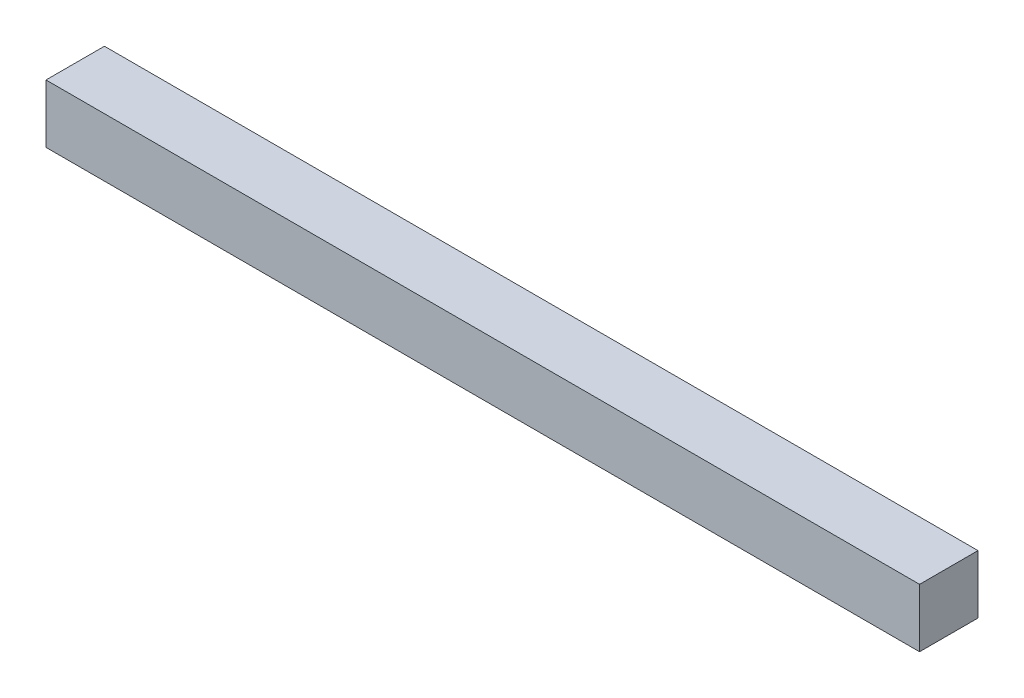
ISO-10303-21;
HEADER;
FILE_DESCRIPTION(('STEP AP214'),'2;1');
FILE_NAME('part.step','',(''),(''),'','','');
FILE_SCHEMA(('AUTOMOTIVE_DESIGN { 1 0 10303 214 1 1 1 1 }'));
ENDSEC;
DATA;
#1=APPLICATION_CONTEXT('core data for automotive mechanical design processes');
#2=APPLICATION_PROTOCOL_DEFINITION('international standard','automotive_design',2000,#1);
#3=PRODUCT_CONTEXT('',#1,'mechanical');
#4=PRODUCT('Part','Part','',(#3));
#5=PRODUCT_RELATED_PRODUCT_CATEGORY('part','',(#4));
#6=PRODUCT_DEFINITION_FORMATION('','',#4);
#7=PRODUCT_DEFINITION_CONTEXT('part definition',#1,'design');
#8=PRODUCT_DEFINITION('design','',#6,#7);
#9=PRODUCT_DEFINITION_SHAPE('','',#8);
#10=(LENGTH_UNIT() NAMED_UNIT(*) SI_UNIT(.MILLI.,.METRE.));
#11=(NAMED_UNIT(*) PLANE_ANGLE_UNIT() SI_UNIT($,.RADIAN.));
#12=(NAMED_UNIT(*) SI_UNIT($,.STERADIAN.) SOLID_ANGLE_UNIT());
#13=UNCERTAINTY_MEASURE_WITH_UNIT(LENGTH_MEASURE(1.E-05),#10,'distance_accuracy_value','');
#14=(GEOMETRIC_REPRESENTATION_CONTEXT(3) GLOBAL_UNCERTAINTY_ASSIGNED_CONTEXT((#13)) GLOBAL_UNIT_ASSIGNED_CONTEXT((#10,
#11,#12)) REPRESENTATION_CONTEXT('',''));
#15=CARTESIAN_POINT('',(0.,0.,0.));
#16=DIRECTION('',(0.,0.,1.));
#17=DIRECTION('',(1.,0.,0.));
#18=AXIS2_PLACEMENT_3D('',#15,#16,#17);
#19=CARTESIAN_POINT('',(189.9,6.35,6.35));
#20=DIRECTION('',(0.,-1.,0.));
#21=DIRECTION('',(0.,0.,-1.));
#22=AXIS2_PLACEMENT_3D('',#19,#20,#21);
#23=PLANE('',#22);
#24=DIRECTION('',(0.,0.,1.));
#25=VECTOR('',#24,1.);
#26=CARTESIAN_POINT('',(0.,6.35,6.35));
#27=LINE('',#26,#25);
#28=CARTESIAN_POINT('',(0.,6.35,-6.35));
#29=VERTEX_POINT('',#28);
#30=CARTESIAN_POINT('',(0.,6.35,6.35));
#31=VERTEX_POINT('',#30);
#32=EDGE_CURVE('E114',#29,#31,#27,.T.);
#33=ORIENTED_EDGE('',*,*,#32,.T.);
#34=DIRECTION('',(-1.,0.,0.));
#35=VECTOR('',#34,1.);
#36=CARTESIAN_POINT('',(189.9,6.35,6.35));
#37=LINE('',#36,#35);
#38=CARTESIAN_POINT('',(189.9,6.35,6.35));
#39=VERTEX_POINT('',#38);
#40=EDGE_CURVE('E11',#39,#31,#37,.T.);
#41=ORIENTED_EDGE('',*,*,#40,.F.);
#42=DIRECTION('',(0.,0.,1.));
#43=VECTOR('',#42,1.);
#44=CARTESIAN_POINT('',(189.9,6.35,6.35));
#45=LINE('',#44,#43);
#46=CARTESIAN_POINT('',(189.9,6.35,-6.35));
#47=VERTEX_POINT('',#46);
#48=EDGE_CURVE('E97',#47,#39,#45,.T.);
#49=ORIENTED_EDGE('',*,*,#48,.F.);
#50=DIRECTION('',(-1.,0.,0.));
#51=VECTOR('',#50,1.);
#52=CARTESIAN_POINT('',(189.9,6.35,-6.35));
#53=LINE('',#52,#51);
#54=EDGE_CURVE('E110',#47,#29,#53,.T.);
#55=ORIENTED_EDGE('',*,*,#54,.T.);
#56=EDGE_LOOP('',(#33,#41,#49,#55));
#57=FACE_BOUND('',#56,.T.);
#58=ADVANCED_FACE('F45',(#57),#23,.F.);
#59=CARTESIAN_POINT('',(189.9,-6.35,6.35));
#60=DIRECTION('',(0.,0.,-1.));
#61=DIRECTION('',(-1.,0.,0.));
#62=AXIS2_PLACEMENT_3D('',#59,#60,#61);
#63=PLANE('',#62);
#64=DIRECTION('',(0.,-1.,0.));
#65=VECTOR('',#64,1.);
#66=CARTESIAN_POINT('',(0.,-6.35,6.35));
#67=LINE('',#66,#65);
#68=CARTESIAN_POINT('',(0.,-6.35,6.35));
#69=VERTEX_POINT('',#68);
#70=EDGE_CURVE('E102',#31,#69,#67,.T.);
#71=ORIENTED_EDGE('',*,*,#70,.T.);
#72=DIRECTION('',(-1.,0.,0.));
#73=VECTOR('',#72,1.);
#74=CARTESIAN_POINT('',(189.9,-6.35,6.35));
#75=LINE('',#74,#73);
#76=CARTESIAN_POINT('',(189.9,-6.35,6.35));
#77=VERTEX_POINT('',#76);
#78=EDGE_CURVE('E54',#77,#69,#75,.T.);
#79=ORIENTED_EDGE('',*,*,#78,.F.);
#80=DIRECTION('',(0.,-1.,0.));
#81=VECTOR('',#80,1.);
#82=CARTESIAN_POINT('',(189.9,-6.35,6.35));
#83=LINE('',#82,#81);
#84=EDGE_CURVE('E92',#39,#77,#83,.T.);
#85=ORIENTED_EDGE('',*,*,#84,.F.);
#86=ORIENTED_EDGE('',*,*,#40,.T.);
#87=EDGE_LOOP('',(#71,#79,#85,#86));
#88=FACE_BOUND('',#87,.T.);
#89=ADVANCED_FACE('F101',(#88),#63,.F.);
#90=CARTESIAN_POINT('',(189.9,-6.35,6.35));
#91=DIRECTION('',(0.,1.,0.));
#92=DIRECTION('',(0.,0.,1.));
#93=AXIS2_PLACEMENT_3D('',#90,#91,#92);
#94=PLANE('',#93);
#95=DIRECTION('',(0.,0.,-1.));
#96=VECTOR('',#95,1.);
#97=CARTESIAN_POINT('',(0.,-6.35,6.35));
#98=LINE('',#97,#96);
#99=CARTESIAN_POINT('',(0.,-6.35,-6.35));
#100=VERTEX_POINT('',#99);
#101=EDGE_CURVE('E79',#69,#100,#98,.T.);
#102=ORIENTED_EDGE('',*,*,#101,.T.);
#103=DIRECTION('',(-1.,0.,0.));
#104=VECTOR('',#103,1.);
#105=CARTESIAN_POINT('',(189.9,-6.35,-6.35));
#106=LINE('',#105,#104);
#107=CARTESIAN_POINT('',(189.9,-6.35,-6.35));
#108=VERTEX_POINT('',#107);
#109=EDGE_CURVE('E104',#108,#100,#106,.T.);
#110=ORIENTED_EDGE('',*,*,#109,.F.);
#111=DIRECTION('',(0.,0.,-1.));
#112=VECTOR('',#111,1.);
#113=CARTESIAN_POINT('',(189.9,-6.35,6.35));
#114=LINE('',#113,#112);
#115=EDGE_CURVE('E95',#77,#108,#114,.T.);
#116=ORIENTED_EDGE('',*,*,#115,.F.);
#117=ORIENTED_EDGE('',*,*,#78,.T.);
#118=EDGE_LOOP('',(#102,#110,#116,#117));
#119=FACE_BOUND('',#118,.T.);
#120=ADVANCED_FACE('F105',(#119),#94,.F.);
#121=CARTESIAN_POINT('',(189.9,-6.35,-6.35));
#122=DIRECTION('',(0.,0.,1.));
#123=DIRECTION('',(1.,0.,0.));
#124=AXIS2_PLACEMENT_3D('',#121,#122,#123);
#125=PLANE('',#124);
#126=DIRECTION('',(0.,1.,0.));
#127=VECTOR('',#126,1.);
#128=CARTESIAN_POINT('',(0.,-6.35,-6.35));
#129=LINE('',#128,#127);
#130=EDGE_CURVE('E85',#100,#29,#129,.T.);
#131=ORIENTED_EDGE('',*,*,#130,.T.);
#132=ORIENTED_EDGE('',*,*,#54,.F.);
#133=DIRECTION('',(0.,1.,0.));
#134=VECTOR('',#133,1.);
#135=CARTESIAN_POINT('',(189.9,-6.35,-6.35));
#136=LINE('',#135,#134);
#137=EDGE_CURVE('E62',#108,#47,#136,.T.);
#138=ORIENTED_EDGE('',*,*,#137,.F.);
#139=ORIENTED_EDGE('',*,*,#109,.T.);
#140=EDGE_LOOP('',(#131,#132,#138,#139));
#141=FACE_BOUND('',#140,.T.);
#142=ADVANCED_FACE('F126',(#141),#125,.F.);
#143=CARTESIAN_POINT('',(189.9,0.,0.));
#144=DIRECTION('',(1.,0.,0.));
#145=DIRECTION('',(0.,0.,-1.));
#146=AXIS2_PLACEMENT_3D('',#143,#144,#145);
#147=PLANE('',#146);
#148=ORIENTED_EDGE('',*,*,#48,.T.);
#149=ORIENTED_EDGE('',*,*,#84,.T.);
#150=ORIENTED_EDGE('',*,*,#115,.T.);
#151=ORIENTED_EDGE('',*,*,#137,.T.);
#152=EDGE_LOOP('',(#148,#149,#150,#151));
#153=FACE_BOUND('',#152,.T.);
#154=ADVANCED_FACE('F93',(#153),#147,.T.);
#155=CARTESIAN_POINT('',(0.,0.,0.));
#156=DIRECTION('',(1.,0.,0.));
#157=DIRECTION('',(0.,0.,-1.));
#158=AXIS2_PLACEMENT_3D('',#155,#156,#157);
#159=PLANE('',#158);
#160=ORIENTED_EDGE('',*,*,#32,.F.);
#161=ORIENTED_EDGE('',*,*,#130,.F.);
#162=ORIENTED_EDGE('',*,*,#101,.F.);
#163=ORIENTED_EDGE('',*,*,#70,.F.);
#164=EDGE_LOOP('',(#160,#161,#162,#163));
#165=FACE_BOUND('',#164,.T.);
#166=ADVANCED_FACE('F129',(#165),#159,.F.);
#167=CLOSED_SHELL('',(#58,#89,#120,#142,#154,#166));
#168=MANIFOLD_SOLID_BREP('B2',#167);
#169=ADVANCED_BREP_SHAPE_REPRESENTATION('',(#18,#168),#14);
#170=SHAPE_DEFINITION_REPRESENTATION(#9,#169);
ENDSEC;
END-ISO-10303-21;
